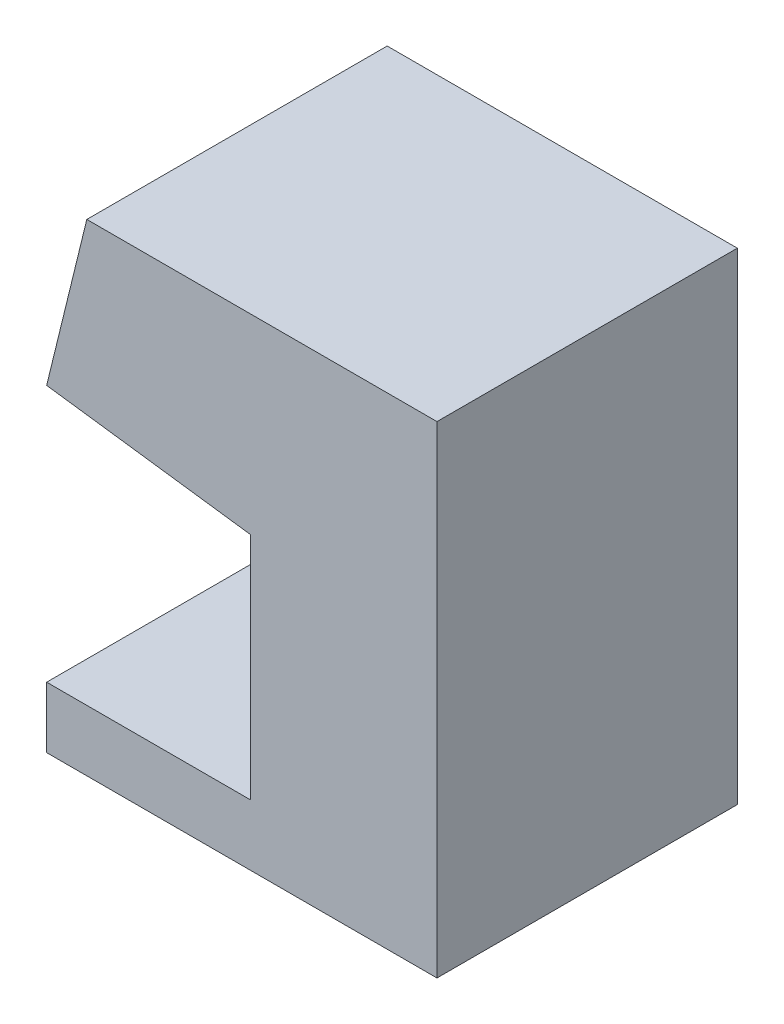
ISO-10303-21;
HEADER;
FILE_DESCRIPTION(('STEP AP214'),'2;1');
FILE_NAME('part.step','',(''),(''),'','','');
FILE_SCHEMA(('AUTOMOTIVE_DESIGN { 1 0 10303 214 1 1 1 1 }'));
ENDSEC;
DATA;
#1=APPLICATION_CONTEXT('core data for automotive mechanical design processes');
#2=APPLICATION_PROTOCOL_DEFINITION('international standard','automotive_design',2000,#1);
#3=PRODUCT_CONTEXT('',#1,'mechanical');
#4=PRODUCT('Part','Part','',(#3));
#5=PRODUCT_RELATED_PRODUCT_CATEGORY('part','',(#4));
#6=PRODUCT_DEFINITION_FORMATION('','',#4);
#7=PRODUCT_DEFINITION_CONTEXT('part definition',#1,'design');
#8=PRODUCT_DEFINITION('design','',#6,#7);
#9=PRODUCT_DEFINITION_SHAPE('','',#8);
#10=(LENGTH_UNIT() NAMED_UNIT(*) SI_UNIT(.MILLI.,.METRE.));
#11=(NAMED_UNIT(*) PLANE_ANGLE_UNIT() SI_UNIT($,.RADIAN.));
#12=(NAMED_UNIT(*) SI_UNIT($,.STERADIAN.) SOLID_ANGLE_UNIT());
#13=UNCERTAINTY_MEASURE_WITH_UNIT(LENGTH_MEASURE(1.E-05),#10,'distance_accuracy_value','');
#14=(GEOMETRIC_REPRESENTATION_CONTEXT(3) GLOBAL_UNCERTAINTY_ASSIGNED_CONTEXT((#13)) GLOBAL_UNIT_ASSIGNED_CONTEXT((#10,
#11,#12)) REPRESENTATION_CONTEXT('',''));
#15=CARTESIAN_POINT('',(0.,0.,0.));
#16=DIRECTION('',(0.,0.,1.));
#17=DIRECTION('',(1.,0.,0.));
#18=AXIS2_PLACEMENT_3D('',#15,#16,#17);
#19=CARTESIAN_POINT('',(0.273207627768474,12.728095538444,211.994589772581));
#20=DIRECTION('',(1.,0.,0.));
#21=DIRECTION('',(0.,1.,0.));
#22=AXIS2_PLACEMENT_3D('',#19,#20,#21);
#23=PLANE('',#22);
#24=DIRECTION('',(0.,-1.,0.));
#25=VECTOR('',#24,1.);
#26=CARTESIAN_POINT('',(0.273207627768474,12.728095538444,24.9945897725811));
#27=LINE('',#26,#25);
#28=CARTESIAN_POINT('',(0.273207627768474,12.728095538444,24.9945897725811));
#29=VERTEX_POINT('',#28);
#30=CARTESIAN_POINT('',(0.273207627768474,-25.271904461556,24.9945897725811));
#31=VERTEX_POINT('',#30);
#32=EDGE_CURVE('P0_E113',#29,#31,#27,.T.);
#33=ORIENTED_EDGE('',*,*,#32,.T.);
#34=DIRECTION('',(0.,0.,-1.));
#35=VECTOR('',#34,1.);
#36=CARTESIAN_POINT('',(0.273207627768474,-25.271904461556,211.994589772581));
#37=LINE('',#36,#35);
#38=CARTESIAN_POINT('',(0.273207627768474,-25.271904461556,211.994589772581));
#39=VERTEX_POINT('',#38);
#40=EDGE_CURVE('P0_E11',#39,#31,#37,.T.);
#41=ORIENTED_EDGE('',*,*,#40,.F.);
#42=DIRECTION('',(0.,-1.,0.));
#43=VECTOR('',#42,1.);
#44=CARTESIAN_POINT('',(0.273207627768474,12.728095538444,211.994589772581));
#45=LINE('',#44,#43);
#46=CARTESIAN_POINT('',(0.273207627768474,12.728095538444,211.994589772581));
#47=VERTEX_POINT('',#46);
#48=EDGE_CURVE('P0_E127',#47,#39,#45,.T.);
#49=ORIENTED_EDGE('',*,*,#48,.F.);
#50=DIRECTION('',(0.,0.,-1.));
#51=VECTOR('',#50,1.);
#52=CARTESIAN_POINT('',(0.273207627768474,12.728095538444,211.994589772581));
#53=LINE('',#52,#51);
#54=EDGE_CURVE('P0_E109',#47,#29,#53,.T.);
#55=ORIENTED_EDGE('',*,*,#54,.T.);
#56=EDGE_LOOP('',(#33,#41,#49,#55));
#57=FACE_BOUND('',#56,.T.);
#58=ADVANCED_FACE('P0_F17',(#57),#23,.F.);
#59=CARTESIAN_POINT('',(0.273207627768474,-25.271904461556,211.994589772581));
#60=DIRECTION('',(0.,1.,0.));
#61=DIRECTION('',(0.,0.,1.));
#62=AXIS2_PLACEMENT_3D('',#59,#60,#61);
#63=PLANE('',#62);
#64=DIRECTION('',(1.,0.,0.));
#65=VECTOR('',#64,1.);
#66=CARTESIAN_POINT('',(0.273207627768474,-25.271904461556,24.9945897725811));
#67=LINE('',#66,#65);
#68=CARTESIAN_POINT('',(243.273207627768,-25.271904461556,24.9945897725811));
#69=VERTEX_POINT('',#68);
#70=EDGE_CURVE('P0_E116',#31,#69,#67,.T.);
#71=ORIENTED_EDGE('',*,*,#70,.T.);
#72=DIRECTION('',(0.,0.,-1.));
#73=VECTOR('',#72,1.);
#74=CARTESIAN_POINT('',(243.273207627768,-25.271904461556,211.994589772581));
#75=LINE('',#74,#73);
#76=CARTESIAN_POINT('',(243.273207627768,-25.271904461556,211.994589772581));
#77=VERTEX_POINT('',#76);
#78=EDGE_CURVE('P0_E25',#77,#69,#75,.T.);
#79=ORIENTED_EDGE('',*,*,#78,.F.);
#80=DIRECTION('',(1.,0.,0.));
#81=VECTOR('',#80,1.);
#82=CARTESIAN_POINT('',(0.273207627768474,-25.271904461556,211.994589772581));
#83=LINE('',#82,#81);
#84=EDGE_CURVE('P0_E76',#39,#77,#83,.T.);
#85=ORIENTED_EDGE('',*,*,#84,.F.);
#86=ORIENTED_EDGE('',*,*,#40,.T.);
#87=EDGE_LOOP('',(#71,#79,#85,#86));
#88=FACE_BOUND('',#87,.T.);
#89=ADVANCED_FACE('P0_F162',(#88),#63,.F.);
#90=CARTESIAN_POINT('',(243.273207627768,-25.271904461556,211.994589772581));
#91=DIRECTION('',(-1.,0.,0.));
#92=DIRECTION('',(0.,-1.,0.));
#93=AXIS2_PLACEMENT_3D('',#90,#91,#92);
#94=PLANE('',#93);
#95=DIRECTION('',(0.,1.,0.));
#96=VECTOR('',#95,1.);
#97=CARTESIAN_POINT('',(243.273207627768,-25.271904461556,24.9945897725811));
#98=LINE('',#97,#96);
#99=CARTESIAN_POINT('',(243.273207627768,274.728095538444,24.9945897725811));
#100=VERTEX_POINT('',#99);
#101=EDGE_CURVE('P0_E118',#69,#100,#98,.T.);
#102=ORIENTED_EDGE('',*,*,#101,.T.);
#103=DIRECTION('',(0.,0.,-1.));
#104=VECTOR('',#103,1.);
#105=CARTESIAN_POINT('',(243.273207627768,274.728095538444,211.994589772581));
#106=LINE('',#105,#104);
#107=CARTESIAN_POINT('',(243.273207627768,274.728095538444,211.994589772581));
#108=VERTEX_POINT('',#107);
#109=EDGE_CURVE('P0_E134',#108,#100,#106,.T.);
#110=ORIENTED_EDGE('',*,*,#109,.F.);
#111=DIRECTION('',(0.,1.,0.));
#112=VECTOR('',#111,1.);
#113=CARTESIAN_POINT('',(243.273207627768,-25.271904461556,211.994589772581));
#114=LINE('',#113,#112);
#115=EDGE_CURVE('P0_E142',#77,#108,#114,.T.);
#116=ORIENTED_EDGE('',*,*,#115,.F.);
#117=ORIENTED_EDGE('',*,*,#78,.T.);
#118=EDGE_LOOP('',(#102,#110,#116,#117));
#119=FACE_BOUND('',#118,.T.);
#120=ADVANCED_FACE('P0_F140',(#119),#94,.F.);
#121=CARTESIAN_POINT('',(243.273207627768,274.728095538444,211.994589772581));
#122=DIRECTION('',(0.,-1.,0.));
#123=DIRECTION('',(1.,0.,0.));
#124=AXIS2_PLACEMENT_3D('',#121,#122,#123);
#125=PLANE('',#124);
#126=DIRECTION('',(-1.,0.,0.));
#127=VECTOR('',#126,1.);
#128=CARTESIAN_POINT('',(243.273207627768,274.728095538444,24.9945897725811));
#129=LINE('',#128,#127);
#130=CARTESIAN_POINT('',(25.2732076277684,274.728095538444,24.9945897725811));
#131=VERTEX_POINT('',#130);
#132=EDGE_CURVE('P0_E120',#100,#131,#129,.T.);
#133=ORIENTED_EDGE('',*,*,#132,.T.);
#134=DIRECTION('',(0.,0.,-1.));
#135=VECTOR('',#134,1.);
#136=CARTESIAN_POINT('',(25.2732076277684,274.728095538444,211.994589772581));
#137=LINE('',#136,#135);
#138=CARTESIAN_POINT('',(25.2732076277684,274.728095538444,211.994589772581));
#139=VERTEX_POINT('',#138);
#140=EDGE_CURVE('P0_E131',#139,#131,#137,.T.);
#141=ORIENTED_EDGE('',*,*,#140,.F.);
#142=DIRECTION('',(-1.,0.,0.));
#143=VECTOR('',#142,1.);
#144=CARTESIAN_POINT('',(243.273207627768,274.728095538444,211.994589772581));
#145=LINE('',#144,#143);
#146=EDGE_CURVE('P0_E154',#108,#139,#145,.T.);
#147=ORIENTED_EDGE('',*,*,#146,.F.);
#148=ORIENTED_EDGE('',*,*,#109,.T.);
#149=EDGE_LOOP('',(#133,#141,#147,#148));
#150=FACE_BOUND('',#149,.T.);
#151=ADVANCED_FACE('P0_F150',(#150),#125,.F.);
#152=CARTESIAN_POINT('',(25.2732076277684,274.728095538444,211.994589772581));
#153=DIRECTION('',(0.971252396495779,-0.238052057964651,0.));
#154=DIRECTION('',(0.238052057964651,0.971252396495779,0.));
#155=AXIS2_PLACEMENT_3D('',#152,#153,#154);
#156=PLANE('',#155);
#157=DIRECTION('',(-0.238052057964651,-0.971252396495779,0.));
#158=VECTOR('',#157,1.);
#159=CARTESIAN_POINT('',(25.2732076277684,274.728095538444,24.9945897725811));
#160=LINE('',#159,#158);
#161=CARTESIAN_POINT('',(0.273207627768487,172.728095538444,24.9945897725811));
#162=VERTEX_POINT('',#161);
#163=EDGE_CURVE('P0_E122',#131,#162,#160,.T.);
#164=ORIENTED_EDGE('',*,*,#163,.T.);
#165=DIRECTION('',(0.,0.,-1.));
#166=VECTOR('',#165,1.);
#167=CARTESIAN_POINT('',(0.273207627768487,172.728095538444,211.994589772581));
#168=LINE('',#167,#166);
#169=CARTESIAN_POINT('',(0.273207627768487,172.728095538444,211.994589772581));
#170=VERTEX_POINT('',#169);
#171=EDGE_CURVE('P0_E104',#170,#162,#168,.T.);
#172=ORIENTED_EDGE('',*,*,#171,.F.);
#173=DIRECTION('',(-0.238052057964651,-0.971252396495779,0.));
#174=VECTOR('',#173,1.);
#175=CARTESIAN_POINT('',(25.2732076277684,274.728095538444,211.994589772581));
#176=LINE('',#175,#174);
#177=EDGE_CURVE('P0_E95',#139,#170,#176,.T.);
#178=ORIENTED_EDGE('',*,*,#177,.F.);
#179=ORIENTED_EDGE('',*,*,#140,.T.);
#180=EDGE_LOOP('',(#164,#172,#178,#179));
#181=FACE_BOUND('',#180,.T.);
#182=ADVANCED_FACE('P0_F153',(#181),#156,.F.);
#183=CARTESIAN_POINT('',(0.273207627768487,172.728095538444,211.994589772581));
#184=DIRECTION('',(0.132674908171722,0.991159608106396,0.));
#185=DIRECTION('',(-0.991159608106396,0.132674908171722,0.));
#186=AXIS2_PLACEMENT_3D('',#183,#184,#185);
#187=PLANE('',#186);
#188=DIRECTION('',(0.991159608106396,-0.132674908171722,0.));
#189=VECTOR('',#188,1.);
#190=CARTESIAN_POINT('',(0.273207627768487,172.728095538444,24.9945897725811));
#191=LINE('',#190,#189);
#192=CARTESIAN_POINT('',(127.273207627768,155.728095538444,24.9945897725811));
#193=VERTEX_POINT('',#192);
#194=EDGE_CURVE('P0_E103',#162,#193,#191,.T.);
#195=ORIENTED_EDGE('',*,*,#194,.T.);
#196=DIRECTION('',(0.,0.,-1.));
#197=VECTOR('',#196,1.);
#198=CARTESIAN_POINT('',(127.273207627768,155.728095538444,211.994589772581));
#199=LINE('',#198,#197);
#200=CARTESIAN_POINT('',(127.273207627768,155.728095538444,211.994589772581));
#201=VERTEX_POINT('',#200);
#202=EDGE_CURVE('P0_E100',#201,#193,#199,.T.);
#203=ORIENTED_EDGE('',*,*,#202,.F.);
#204=DIRECTION('',(0.991159608106396,-0.132674908171722,0.));
#205=VECTOR('',#204,1.);
#206=CARTESIAN_POINT('',(0.273207627768487,172.728095538444,211.994589772581));
#207=LINE('',#206,#205);
#208=EDGE_CURVE('P0_E89',#170,#201,#207,.T.);
#209=ORIENTED_EDGE('',*,*,#208,.F.);
#210=ORIENTED_EDGE('',*,*,#171,.T.);
#211=EDGE_LOOP('',(#195,#203,#209,#210));
#212=FACE_BOUND('',#211,.T.);
#213=ADVANCED_FACE('P0_F101',(#212),#187,.F.);
#214=CARTESIAN_POINT('',(127.273207627768,155.728095538444,211.994589772581));
#215=DIRECTION('',(1.,0.,0.));
#216=DIRECTION('',(0.,1.,0.));
#217=AXIS2_PLACEMENT_3D('',#214,#215,#216);
#218=PLANE('',#217);
#219=DIRECTION('',(0.,-1.,0.));
#220=VECTOR('',#219,1.);
#221=CARTESIAN_POINT('',(127.273207627768,155.728095538444,24.9945897725811));
#222=LINE('',#221,#220);
#223=CARTESIAN_POINT('',(127.273207627768,12.728095538444,24.9945897725811));
#224=VERTEX_POINT('',#223);
#225=EDGE_CURVE('P0_E62',#193,#224,#222,.T.);
#226=ORIENTED_EDGE('',*,*,#225,.T.);
#227=DIRECTION('',(0.,0.,-1.));
#228=VECTOR('',#227,1.);
#229=CARTESIAN_POINT('',(127.273207627768,12.728095538444,211.994589772581));
#230=LINE('',#229,#228);
#231=CARTESIAN_POINT('',(127.273207627768,12.728095538444,211.994589772581));
#232=VERTEX_POINT('',#231);
#233=EDGE_CURVE('P0_E105',#232,#224,#230,.T.);
#234=ORIENTED_EDGE('',*,*,#233,.F.);
#235=DIRECTION('',(0.,-1.,0.));
#236=VECTOR('',#235,1.);
#237=CARTESIAN_POINT('',(127.273207627768,155.728095538444,211.994589772581));
#238=LINE('',#237,#236);
#239=EDGE_CURVE('P0_E93',#201,#232,#238,.T.);
#240=ORIENTED_EDGE('',*,*,#239,.F.);
#241=ORIENTED_EDGE('',*,*,#202,.T.);
#242=EDGE_LOOP('',(#226,#234,#240,#241));
#243=FACE_BOUND('',#242,.T.);
#244=ADVANCED_FACE('P0_F107',(#243),#218,.F.);
#245=CARTESIAN_POINT('',(127.273207627768,12.728095538444,211.994589772581));
#246=DIRECTION('',(0.,-1.,0.));
#247=DIRECTION('',(1.,0.,0.));
#248=AXIS2_PLACEMENT_3D('',#245,#246,#247);
#249=PLANE('',#248);
#250=DIRECTION('',(-1.,0.,0.));
#251=VECTOR('',#250,1.);
#252=CARTESIAN_POINT('',(127.273207627768,12.728095538444,24.9945897725811));
#253=LINE('',#252,#251);
#254=EDGE_CURVE('P0_E68',#224,#29,#253,.T.);
#255=ORIENTED_EDGE('',*,*,#254,.T.);
#256=ORIENTED_EDGE('',*,*,#54,.F.);
#257=DIRECTION('',(-1.,0.,0.));
#258=VECTOR('',#257,1.);
#259=CARTESIAN_POINT('',(127.273207627768,12.728095538444,211.994589772581));
#260=LINE('',#259,#258);
#261=EDGE_CURVE('P0_E33',#232,#47,#260,.T.);
#262=ORIENTED_EDGE('',*,*,#261,.F.);
#263=ORIENTED_EDGE('',*,*,#233,.T.);
#264=EDGE_LOOP('',(#255,#256,#262,#263));
#265=FACE_BOUND('',#264,.T.);
#266=ADVANCED_FACE('P0_F179',(#265),#249,.F.);
#267=CARTESIAN_POINT('',(0.273207627768474,-25.271904461556,211.994589772581));
#268=DIRECTION('',(0.,0.,1.));
#269=DIRECTION('',(1.,0.,0.));
#270=AXIS2_PLACEMENT_3D('',#267,#268,#269);
#271=PLANE('',#270);
#272=ORIENTED_EDGE('',*,*,#48,.T.);
#273=ORIENTED_EDGE('',*,*,#84,.T.);
#274=ORIENTED_EDGE('',*,*,#115,.T.);
#275=ORIENTED_EDGE('',*,*,#146,.T.);
#276=ORIENTED_EDGE('',*,*,#177,.T.);
#277=ORIENTED_EDGE('',*,*,#208,.T.);
#278=ORIENTED_EDGE('',*,*,#239,.T.);
#279=ORIENTED_EDGE('',*,*,#261,.T.);
#280=EDGE_LOOP('',(#272,#273,#274,#275,#276,#277,#278,#279));
#281=FACE_BOUND('',#280,.T.);
#282=ADVANCED_FACE('P0_F91',(#281),#271,.T.);
#283=CARTESIAN_POINT('',(0.273207627768474,-25.271904461556,24.9945897725811));
#284=DIRECTION('',(0.,0.,1.));
#285=DIRECTION('',(1.,0.,0.));
#286=AXIS2_PLACEMENT_3D('',#283,#284,#285);
#287=PLANE('',#286);
#288=ORIENTED_EDGE('',*,*,#32,.F.);
#289=ORIENTED_EDGE('',*,*,#254,.F.);
#290=ORIENTED_EDGE('',*,*,#225,.F.);
#291=ORIENTED_EDGE('',*,*,#194,.F.);
#292=ORIENTED_EDGE('',*,*,#163,.F.);
#293=ORIENTED_EDGE('',*,*,#132,.F.);
#294=ORIENTED_EDGE('',*,*,#101,.F.);
#295=ORIENTED_EDGE('',*,*,#70,.F.);
#296=EDGE_LOOP('',(#288,#289,#290,#291,#292,#293,#294,#295));
#297=FACE_BOUND('',#296,.T.);
#298=ADVANCED_FACE('P0_F146',(#297),#287,.F.);
#299=CLOSED_SHELL('',(#58,#89,#120,#151,#182,#213,#244,#266,#282,#298));
#300=MANIFOLD_SOLID_BREP('P0_B1',#299);
#301=CARTESIAN_POINT('',(-17.497609967378,112.825445257248,115.304379274191));
#302=DIRECTION('',(-0.971252396495779,0.238052057964651,0.));
#303=DIRECTION('',(0.,0.,1.));
#304=AXIS2_PLACEMENT_3D('',#301,#302,#303);
#305=PLANE('',#304);
#306=DIRECTION('',(-0.238052057964651,-0.971252396495779,0.));
#307=VECTOR('',#306,1.);
#308=CARTESIAN_POINT('',(4.1541990002103,201.164825845009,112.082907419137));
#309=LINE('',#308,#307);
#310=CARTESIAN_POINT('',(15.7089231899796,248.308100539268,112.082907419137));
#311=VERTEX_POINT('',#310);
#312=CARTESIAN_POINT('',(4.1541990002103,201.164825845009,112.082907419137));
#313=VERTEX_POINT('',#312);
#314=EDGE_CURVE('P1_E32',#311,#313,#309,.T.);
#315=ORIENTED_EDGE('',*,*,#314,.F.);
#316=CARTESIAN_POINT('',(9.93156109509496,224.736463192139,118.788748595859));
#317=DIRECTION('',(-0.971252396495779,0.238052057964651,0.));
#318=DIRECTION('',(0.,0.,1.));
#319=AXIS2_PLACEMENT_3D('',#316,#317,#318);
#320=CIRCLE('',#319,25.1787272491567);
#321=EDGE_CURVE('P1_E59',#311,#313,#320,.T.);
#322=ORIENTED_EDGE('',*,*,#321,.T.);
#323=EDGE_LOOP('',(#315,#322));
#324=FACE_BOUND('',#323,.T.);
#325=ADVANCED_FACE('P1_F16',(#324),#305,.T.);
#326=CARTESIAN_POINT('',(9.93156109509496,224.736463192139,118.788748595859));
#327=DIRECTION('',(0.971252396495779,-0.238052057964651,0.));
#328=DIRECTION('',(0.,0.,-1.));
#329=AXIS2_PLACEMENT_3D('',#326,#327,#328);
#330=CYLINDRICAL_SURFACE('',#329,25.1787272491567);
#331=CARTESIAN_POINT('',(12.8453182845823,224.022307018245,118.788748595859));
#332=DIRECTION('',(-0.971252396495779,0.238052057964651,0.));
#333=DIRECTION('',(0.,0.,1.));
#334=AXIS2_PLACEMENT_3D('',#331,#332,#333);
#335=CIRCLE('',#334,25.1787272491567);
#336=CARTESIAN_POINT('',(18.622680379467,247.593944365374,112.082907419137));
#337=VERTEX_POINT('',#336);
#338=CARTESIAN_POINT('',(7.06795618969764,200.450669671115,112.082907419137));
#339=VERTEX_POINT('',#338);
#340=EDGE_CURVE('P1_E100',#337,#339,#335,.T.);
#341=ORIENTED_EDGE('',*,*,#340,.T.);
#342=DIRECTION('',(0.971252396495779,-0.238052057964651,0.));
#343=VECTOR('',#342,1.);
#344=CARTESIAN_POINT('',(4.1541990002103,201.164825845009,112.082907419137));
#345=LINE('',#344,#343);
#346=EDGE_CURVE('P1_E10',#313,#339,#345,.T.);
#347=ORIENTED_EDGE('',*,*,#346,.F.);
#348=ORIENTED_EDGE('',*,*,#321,.F.);
#349=DIRECTION('',(0.971252396495779,-0.238052057964651,0.));
#350=VECTOR('',#349,1.);
#351=CARTESIAN_POINT('',(15.7089231899796,248.308100539268,112.082907419137));
#352=LINE('',#351,#350);
#353=EDGE_CURVE('P1_E57',#311,#337,#352,.T.);
#354=ORIENTED_EDGE('',*,*,#353,.T.);
#355=EDGE_LOOP('',(#341,#347,#348,#354));
#356=FACE_BOUND('',#355,.T.);
#357=ADVANCED_FACE('P1_F18',(#356),#330,.T.);
#358=CARTESIAN_POINT('',(4.1541990002103,201.164825845009,115.304379274191));
#359=DIRECTION('',(0.238052057964651,0.971252396495779,0.));
#360=DIRECTION('',(-0.971252396495779,0.238052057964651,0.));
#361=AXIS2_PLACEMENT_3D('',#358,#359,#360);
#362=PLANE('',#361);
#363=DIRECTION('',(0.,0.,1.));
#364=VECTOR('',#363,1.);
#365=CARTESIAN_POINT('',(7.06795618969764,200.450669671115,115.304379274191));
#366=LINE('',#365,#364);
#367=CARTESIAN_POINT('',(7.06795618969764,200.450669671115,125.494589772581));
#368=VERTEX_POINT('',#367);
#369=EDGE_CURVE('P1_E102',#339,#368,#366,.T.);
#370=ORIENTED_EDGE('',*,*,#369,.T.);
#371=DIRECTION('',(0.971252396495779,-0.238052057964651,0.));
#372=VECTOR('',#371,1.);
#373=CARTESIAN_POINT('',(4.1541990002103,201.164825845009,125.494589772581));
#374=LINE('',#373,#372);
#375=CARTESIAN_POINT('',(4.1541990002103,201.164825845009,125.494589772581));
#376=VERTEX_POINT('',#375);
#377=EDGE_CURVE('P1_E25',#376,#368,#374,.T.);
#378=ORIENTED_EDGE('',*,*,#377,.F.);
#379=DIRECTION('',(0.971252396495779,-0.238052057964651,0.));
#380=VECTOR('',#379,1.);
#381=CARTESIAN_POINT('',(-5.55832496474749,203.545346424656,125.494589772581));
#382=LINE('',#381,#380);
#383=CARTESIAN_POINT('',(-5.55832496474749,203.545346424656,125.494589772581));
#384=VERTEX_POINT('',#383);
#385=EDGE_CURVE('P1_E84',#384,#376,#382,.T.);
#386=ORIENTED_EDGE('',*,*,#385,.F.);
#387=DIRECTION('',(0.,0.,1.));
#388=VECTOR('',#387,1.);
#389=CARTESIAN_POINT('',(-5.55832496474749,203.545346424656,125.494589772581));
#390=LINE('',#389,#388);
#391=CARTESIAN_POINT('',(-5.55832496474749,203.545346424656,112.082907419137));
#392=VERTEX_POINT('',#391);
#393=EDGE_CURVE('P1_E77',#392,#384,#390,.T.);
#394=ORIENTED_EDGE('',*,*,#393,.F.);
#395=DIRECTION('',(0.971252396495779,-0.238052057964651,0.));
#396=VECTOR('',#395,1.);
#397=CARTESIAN_POINT('',(-5.55832496474749,203.545346424656,112.082907419137));
#398=LINE('',#397,#396);
#399=EDGE_CURVE('P1_E81',#392,#313,#398,.T.);
#400=ORIENTED_EDGE('',*,*,#399,.T.);
#401=ORIENTED_EDGE('',*,*,#346,.T.);
#402=EDGE_LOOP('',(#370,#378,#386,#394,#400,#401));
#403=FACE_BOUND('',#402,.T.);
#404=ADVANCED_FACE('P1_F79',(#403),#362,.F.);
#405=CARTESIAN_POINT('',(9.93156109509496,224.736463192139,118.788748595859));
#406=DIRECTION('',(0.971252396495779,-0.238052057964651,0.));
#407=DIRECTION('',(0.,0.,-1.));
#408=AXIS2_PLACEMENT_3D('',#405,#406,#407);
#409=CYLINDRICAL_SURFACE('',#408,25.1787272491567);
#410=CARTESIAN_POINT('',(12.8453182845823,224.022307018245,118.788748595859));
#411=DIRECTION('',(-0.971252396495779,0.238052057964651,0.));
#412=DIRECTION('',(0.,0.,1.));
#413=AXIS2_PLACEMENT_3D('',#410,#411,#412);
#414=CIRCLE('',#413,25.1787272491567);
#415=CARTESIAN_POINT('',(18.622680379467,247.593944365374,125.494589772581));
#416=VERTEX_POINT('',#415);
#417=EDGE_CURVE('P1_E114',#368,#416,#414,.T.);
#418=ORIENTED_EDGE('',*,*,#417,.T.);
#419=DIRECTION('',(0.971252396495779,-0.238052057964651,0.));
#420=VECTOR('',#419,1.);
#421=CARTESIAN_POINT('',(15.7089231899796,248.308100539268,125.494589772581));
#422=LINE('',#421,#420);
#423=CARTESIAN_POINT('',(15.7089231899796,248.308100539268,125.494589772581));
#424=VERTEX_POINT('',#423);
#425=EDGE_CURVE('P1_E51',#424,#416,#422,.T.);
#426=ORIENTED_EDGE('',*,*,#425,.F.);
#427=CARTESIAN_POINT('',(9.93156109509496,224.736463192139,118.788748595859));
#428=DIRECTION('',(-0.971252396495779,0.238052057964651,0.));
#429=DIRECTION('',(0.,0.,1.));
#430=AXIS2_PLACEMENT_3D('',#427,#428,#429);
#431=CIRCLE('',#430,25.1787272491567);
#432=EDGE_CURVE('P1_E109',#376,#424,#431,.T.);
#433=ORIENTED_EDGE('',*,*,#432,.F.);
#434=ORIENTED_EDGE('',*,*,#377,.T.);
#435=EDGE_LOOP('',(#418,#426,#433,#434));
#436=FACE_BOUND('',#435,.T.);
#437=ADVANCED_FACE('P1_F123',(#436),#409,.T.);
#438=CARTESIAN_POINT('',(15.7089231899796,248.308100539268,115.304379274191));
#439=DIRECTION('',(0.238052057964651,0.971252396495779,0.));
#440=DIRECTION('',(-0.971252396495779,0.238052057964651,0.));
#441=AXIS2_PLACEMENT_3D('',#438,#439,#440);
#442=PLANE('',#441);
#443=DIRECTION('',(0.,0.,1.));
#444=VECTOR('',#443,1.);
#445=CARTESIAN_POINT('',(18.622680379467,247.593944365374,115.304379274191));
#446=LINE('',#445,#444);
#447=EDGE_CURVE('P1_E110',#337,#416,#446,.T.);
#448=ORIENTED_EDGE('',*,*,#447,.F.);
#449=ORIENTED_EDGE('',*,*,#353,.F.);
#450=DIRECTION('',(0.971252396495779,-0.238052057964651,0.));
#451=VECTOR('',#450,1.);
#452=CARTESIAN_POINT('',(5.99639922502182,250.688621118915,112.082907419137));
#453=LINE('',#452,#451);
#454=CARTESIAN_POINT('',(5.99639922502182,250.688621118915,112.082907419137));
#455=VERTEX_POINT('',#454);
#456=EDGE_CURVE('P1_E127',#455,#311,#453,.T.);
#457=ORIENTED_EDGE('',*,*,#456,.F.);
#458=DIRECTION('',(0.,0.,-1.));
#459=VECTOR('',#458,1.);
#460=CARTESIAN_POINT('',(5.99639922502182,250.688621118915,112.082907419137));
#461=LINE('',#460,#459);
#462=CARTESIAN_POINT('',(5.99639922502182,250.688621118915,125.494589772581));
#463=VERTEX_POINT('',#462);
#464=EDGE_CURVE('P1_E93',#463,#455,#461,.T.);
#465=ORIENTED_EDGE('',*,*,#464,.F.);
#466=DIRECTION('',(0.971252396495779,-0.238052057964651,0.));
#467=VECTOR('',#466,1.);
#468=CARTESIAN_POINT('',(5.99639922502182,250.688621118915,125.494589772581));
#469=LINE('',#468,#467);
#470=EDGE_CURVE('P1_E104',#463,#424,#469,.T.);
#471=ORIENTED_EDGE('',*,*,#470,.T.);
#472=ORIENTED_EDGE('',*,*,#425,.T.);
#473=EDGE_LOOP('',(#448,#449,#457,#465,#471,#472));
#474=FACE_BOUND('',#473,.T.);
#475=ADVANCED_FACE('P1_F126',(#474),#442,.T.);
#476=DIRECTION('',(0.238052057964651,0.971252396495779,0.));
#477=VECTOR('',#476,1.);
#478=CARTESIAN_POINT('',(15.7089231899796,248.308100539268,125.494589772581));
#479=LINE('',#478,#477);
#480=EDGE_CURVE('P1_E97',#376,#424,#479,.T.);
#481=ORIENTED_EDGE('',*,*,#480,.F.);
#482=ORIENTED_EDGE('',*,*,#432,.T.);
#483=EDGE_LOOP('',(#481,#482));
#484=FACE_BOUND('',#483,.T.);
#485=ADVANCED_FACE('P1_F138',(#484),#305,.T.);
#486=CARTESIAN_POINT('',(-14.5838527778907,112.111289083354,115.304379274191));
#487=DIRECTION('',(-0.971252396495779,0.238052057964651,0.));
#488=DIRECTION('',(0.,0.,1.));
#489=AXIS2_PLACEMENT_3D('',#486,#487,#488);
#490=PLANE('',#489);
#491=ORIENTED_EDGE('',*,*,#340,.F.);
#492=ORIENTED_EDGE('',*,*,#447,.T.);
#493=ORIENTED_EDGE('',*,*,#417,.F.);
#494=ORIENTED_EDGE('',*,*,#369,.F.);
#495=EDGE_LOOP('',(#491,#492,#493,#494));
#496=FACE_BOUND('',#495,.T.);
#497=ADVANCED_FACE('P1_F125',(#496),#490,.F.);
#498=CARTESIAN_POINT('',(-5.55832496474749,203.545346424656,112.082907419137));
#499=DIRECTION('',(0.,0.,1.));
#500=DIRECTION('',(0.971252396495779,-0.238052057964651,0.));
#501=AXIS2_PLACEMENT_3D('',#498,#499,#500);
#502=PLANE('',#501);
#503=ORIENTED_EDGE('',*,*,#314,.T.);
#504=ORIENTED_EDGE('',*,*,#399,.F.);
#505=DIRECTION('',(-0.238052057964651,-0.971252396495779,0.));
#506=VECTOR('',#505,1.);
#507=CARTESIAN_POINT('',(-5.55832496474749,203.545346424656,112.082907419137));
#508=LINE('',#507,#506);
#509=EDGE_CURVE('P1_E88',#455,#392,#508,.T.);
#510=ORIENTED_EDGE('',*,*,#509,.F.);
#511=ORIENTED_EDGE('',*,*,#456,.T.);
#512=EDGE_LOOP('',(#503,#504,#510,#511));
#513=FACE_BOUND('',#512,.T.);
#514=ADVANCED_FACE('P1_F99',(#513),#502,.F.);
#515=CARTESIAN_POINT('',(5.99639922502182,250.688621118915,125.494589772581));
#516=DIRECTION('',(0.,0.,-1.));
#517=DIRECTION('',(-0.971252396495779,0.238052057964651,0.));
#518=AXIS2_PLACEMENT_3D('',#515,#516,#517);
#519=PLANE('',#518);
#520=ORIENTED_EDGE('',*,*,#480,.T.);
#521=ORIENTED_EDGE('',*,*,#470,.F.);
#522=DIRECTION('',(0.238052057964651,0.971252396495779,0.));
#523=VECTOR('',#522,1.);
#524=CARTESIAN_POINT('',(5.99639922502182,250.688621118915,125.494589772581));
#525=LINE('',#524,#523);
#526=EDGE_CURVE('P1_E87',#384,#463,#525,.T.);
#527=ORIENTED_EDGE('',*,*,#526,.F.);
#528=ORIENTED_EDGE('',*,*,#385,.T.);
#529=EDGE_LOOP('',(#520,#521,#527,#528));
#530=FACE_BOUND('',#529,.T.);
#531=ADVANCED_FACE('P1_F136',(#530),#519,.F.);
#532=CARTESIAN_POINT('',(-27.2101339323358,115.205965836895,115.304379274191));
#533=DIRECTION('',(0.971252396495779,-0.238052057964651,0.));
#534=DIRECTION('',(0.,0.,-1.));
#535=AXIS2_PLACEMENT_3D('',#532,#533,#534);
#536=PLANE('',#535);
#537=ORIENTED_EDGE('',*,*,#509,.T.);
#538=ORIENTED_EDGE('',*,*,#393,.T.);
#539=ORIENTED_EDGE('',*,*,#526,.T.);
#540=ORIENTED_EDGE('',*,*,#464,.T.);
#541=EDGE_LOOP('',(#537,#538,#539,#540));
#542=FACE_BOUND('',#541,.T.);
#543=ADVANCED_FACE('P1_F91',(#542),#536,.F.);
#544=CLOSED_SHELL('',(#325,#357,#404,#437,#475,#485,#497,#514,#531,#543));
#545=MANIFOLD_SOLID_BREP('P1_B1',#544);
#546=CARTESIAN_POINT('',(57.4056918160616,158.728095538444,117.494589772581));
#547=DIRECTION('',(0.,-1.,0.));
#548=DIRECTION('',(-1.,0.,0.));
#549=AXIS2_PLACEMENT_3D('',#546,#547,#548);
#550=CYLINDRICAL_SURFACE('',#549,39.5);
#551=CARTESIAN_POINT('',(57.4056918160616,158.728095538444,117.494589772581));
#552=DIRECTION('',(0.,1.,0.));
#553=DIRECTION('',(1.,0.,0.));
#554=AXIS2_PLACEMENT_3D('',#551,#552,#553);
#555=CIRCLE('',#554,39.5);
#556=CARTESIAN_POINT('',(17.9056918160616,158.728095538444,117.494589772581));
#557=VERTEX_POINT('',#556);
#558=EDGE_CURVE('P2_E10',#557,#557,#555,.T.);
#559=CARTESIAN_POINT('',(57.4056918160616,145.728095538444,117.494589772581));
#560=DIRECTION('',(0.,1.,0.));
#561=DIRECTION('',(1.,0.,0.));
#562=AXIS2_PLACEMENT_3D('',#559,#560,#561);
#563=CIRCLE('',#562,39.5);
#564=CARTESIAN_POINT('',(17.9056918160616,145.728095538444,117.494589772581));
#565=VERTEX_POINT('',#564);
#566=EDGE_CURVE('P2_E18',#565,#565,#563,.T.);
#567=CARTESIAN_POINT('',(17.9056918160616,158.728095538444,117.494589772581));
#568=CARTESIAN_POINT('',(17.9056918160616,158.592678871777,117.494589772581));
#569=CARTESIAN_POINT('',(17.9056918160616,158.457262205111,117.494589772581));
#570=CARTESIAN_POINT('',(17.9056918160616,158.186428871777,117.494589772581));
#571=CARTESIAN_POINT('',(17.9056918160616,158.051012205111,117.494589772581));
#572=CARTESIAN_POINT('',(17.9056918160616,157.780178871777,117.494589772581));
#573=CARTESIAN_POINT('',(17.9056918160616,157.644762205111,117.494589772581));
#574=CARTESIAN_POINT('',(17.9056918160616,157.373928871777,117.494589772581));
#575=CARTESIAN_POINT('',(17.9056918160616,157.238512205111,117.494589772581));
#576=CARTESIAN_POINT('',(17.9056918160616,156.967678871777,117.494589772581));
#577=CARTESIAN_POINT('',(17.9056918160616,156.832262205111,117.494589772581));
#578=CARTESIAN_POINT('',(17.9056918160616,156.561428871777,117.494589772581));
#579=CARTESIAN_POINT('',(17.9056918160616,156.426012205111,117.494589772581));
#580=CARTESIAN_POINT('',(17.9056918160616,156.155178871777,117.494589772581));
#581=CARTESIAN_POINT('',(17.9056918160616,156.019762205111,117.494589772581));
#582=CARTESIAN_POINT('',(17.9056918160616,155.748928871777,117.494589772581));
#583=CARTESIAN_POINT('',(17.9056918160616,155.613512205111,117.494589772581));
#584=CARTESIAN_POINT('',(17.9056918160616,155.342678871777,117.494589772581));
#585=CARTESIAN_POINT('',(17.9056918160616,155.207262205111,117.494589772581));
#586=CARTESIAN_POINT('',(17.9056918160616,154.936428871777,117.494589772581));
#587=CARTESIAN_POINT('',(17.9056918160616,154.801012205111,117.494589772581));
#588=CARTESIAN_POINT('',(17.9056918160616,154.530178871777,117.494589772581));
#589=CARTESIAN_POINT('',(17.9056918160616,154.394762205111,117.494589772581));
#590=CARTESIAN_POINT('',(17.9056918160616,154.123928871777,117.494589772581));
#591=CARTESIAN_POINT('',(17.9056918160616,153.988512205111,117.494589772581));
#592=CARTESIAN_POINT('',(17.9056918160616,153.717678871777,117.494589772581));
#593=CARTESIAN_POINT('',(17.9056918160616,153.582262205111,117.494589772581));
#594=CARTESIAN_POINT('',(17.9056918160616,153.311428871777,117.494589772581));
#595=CARTESIAN_POINT('',(17.9056918160616,153.176012205111,117.494589772581));
#596=CARTESIAN_POINT('',(17.9056918160616,152.905178871777,117.494589772581));
#597=CARTESIAN_POINT('',(17.9056918160616,152.769762205111,117.494589772581));
#598=CARTESIAN_POINT('',(17.9056918160616,152.498928871777,117.494589772581));
#599=CARTESIAN_POINT('',(17.9056918160616,152.363512205111,117.494589772581));
#600=CARTESIAN_POINT('',(17.9056918160616,152.092678871777,117.494589772581));
#601=CARTESIAN_POINT('',(17.9056918160616,151.957262205111,117.494589772581));
#602=CARTESIAN_POINT('',(17.9056918160616,151.686428871777,117.494589772581));
#603=CARTESIAN_POINT('',(17.9056918160616,151.551012205111,117.494589772581));
#604=CARTESIAN_POINT('',(17.9056918160616,151.280178871777,117.494589772581));
#605=CARTESIAN_POINT('',(17.9056918160616,151.144762205111,117.494589772581));
#606=CARTESIAN_POINT('',(17.9056918160616,150.873928871777,117.494589772581));
#607=CARTESIAN_POINT('',(17.9056918160616,150.738512205111,117.494589772581));
#608=CARTESIAN_POINT('',(17.9056918160616,150.467678871777,117.494589772581));
#609=CARTESIAN_POINT('',(17.9056918160616,150.332262205111,117.494589772581));
#610=CARTESIAN_POINT('',(17.9056918160616,150.061428871777,117.494589772581));
#611=CARTESIAN_POINT('',(17.9056918160616,149.926012205111,117.494589772581));
#612=CARTESIAN_POINT('',(17.9056918160616,149.655178871777,117.494589772581));
#613=CARTESIAN_POINT('',(17.9056918160616,149.519762205111,117.494589772581));
#614=CARTESIAN_POINT('',(17.9056918160616,149.248928871777,117.494589772581));
#615=CARTESIAN_POINT('',(17.9056918160616,149.113512205111,117.494589772581));
#616=CARTESIAN_POINT('',(17.9056918160616,148.842678871777,117.494589772581));
#617=CARTESIAN_POINT('',(17.9056918160616,148.707262205111,117.494589772581));
#618=CARTESIAN_POINT('',(17.9056918160616,148.436428871777,117.494589772581));
#619=CARTESIAN_POINT('',(17.9056918160616,148.301012205111,117.494589772581));
#620=CARTESIAN_POINT('',(17.9056918160616,148.030178871777,117.494589772581));
#621=CARTESIAN_POINT('',(17.9056918160616,147.894762205111,117.494589772581));
#622=CARTESIAN_POINT('',(17.9056918160616,147.623928871777,117.494589772581));
#623=CARTESIAN_POINT('',(17.9056918160616,147.488512205111,117.494589772581));
#624=CARTESIAN_POINT('',(17.9056918160616,147.217678871777,117.494589772581));
#625=CARTESIAN_POINT('',(17.9056918160616,147.082262205111,117.494589772581));
#626=CARTESIAN_POINT('',(17.9056918160616,146.811428871777,117.494589772581));
#627=CARTESIAN_POINT('',(17.9056918160616,146.676012205111,117.494589772581));
#628=CARTESIAN_POINT('',(17.9056918160616,146.405178871777,117.494589772581));
#629=CARTESIAN_POINT('',(17.9056918160616,146.269762205111,117.494589772581));
#630=CARTESIAN_POINT('',(17.9056918160616,145.998928871777,117.494589772581));
#631=CARTESIAN_POINT('',(17.9056918160616,145.863512205111,117.494589772581));
#632=CARTESIAN_POINT('',(17.9056918160616,145.728095538444,117.494589772581));
#633=B_SPLINE_CURVE_WITH_KNOTS('',3,(#567,#568,#569,#570,#571,#572,#573,#574,#575,#576,#577,
#578,#579,#580,#581,#582,#583,#584,#585,#586,#587,#588,#589,#590,#591,#592,#593,#594,#595,#596,
#597,#598,#599,#600,#601,#602,#603,#604,#605,#606,#607,#608,#609,#610,#611,#612,#613,#614,#615,
#616,#617,#618,#619,#620,#621,#622,#623,#624,#625,#626,#627,#628,#629,#630,#631,#632),
.UNSPECIFIED.,.F.,.F.,(4,2,2,2,2,2,2,2,2,2,2,2,2,2,2,2,2,2,2,2,2,2,2,2,2,2,2,2,2,2,2,2,4),(0.,
0.406250000000025,0.812500000000022,1.21875000000002,1.62500000000002,2.03125000000001,
2.43750000000001,2.84375000000001,3.25,3.65625000000003,4.06250000000002,4.46875000000002,
4.87500000000002,5.28125000000002,5.68750000000001,6.09375000000001,6.50000000000001,
6.90625000000003,7.31250000000003,7.71875000000002,8.12500000000002,8.53125000000002,
8.93750000000001,9.34375000000001,9.75000000000001,10.15625,10.5625,10.96875,11.375,11.78125,
12.1875,12.59375,13.),.UNSPECIFIED.);
#634=EDGE_CURVE('P2_BSEAM15',#557,#565,#633,.T.);
#635=ORIENTED_EDGE('',*,*,#558,.F.);
#636=ORIENTED_EDGE('',*,*,#566,.T.);
#637=ORIENTED_EDGE('',*,*,#634,.T.);
#638=ORIENTED_EDGE('',*,*,#634,.F.);
#639=EDGE_LOOP('',(#635,#637,#636,#638));
#640=FACE_BOUND('',#639,.T.);
#641=ADVANCED_FACE('P2_F15',(#640),#550,.T.);
#642=CARTESIAN_POINT('',(57.4056918160616,158.728095538444,117.494589772581));
#643=DIRECTION('',(0.,1.,0.));
#644=DIRECTION('',(1.,0.,0.));
#645=AXIS2_PLACEMENT_3D('',#642,#643,#644);
#646=PLANE('',#645);
#647=ORIENTED_EDGE('',*,*,#558,.T.);
#648=EDGE_LOOP('',(#647));
#649=FACE_BOUND('',#648,.T.);
#650=ADVANCED_FACE('P2_F30',(#649),#646,.T.);
#651=CARTESIAN_POINT('',(57.4056918160616,145.728095538444,117.494589772581));
#652=DIRECTION('',(0.,1.,0.));
#653=DIRECTION('',(1.,0.,0.));
#654=AXIS2_PLACEMENT_3D('',#651,#652,#653);
#655=PLANE('',#654);
#656=ORIENTED_EDGE('',*,*,#566,.F.);
#657=EDGE_LOOP('',(#656));
#658=FACE_BOUND('',#657,.T.);
#659=ADVANCED_FACE('P2_F28',(#658),#655,.F.);
#660=CLOSED_SHELL('',(#641,#650,#659));
#661=MANIFOLD_SOLID_BREP('P2_B1',#660);
#662=ADVANCED_BREP_SHAPE_REPRESENTATION('',(#18,#300,#545,#661),#14);
#663=SHAPE_DEFINITION_REPRESENTATION(#9,#662);
ENDSEC;
END-ISO-10303-21;
